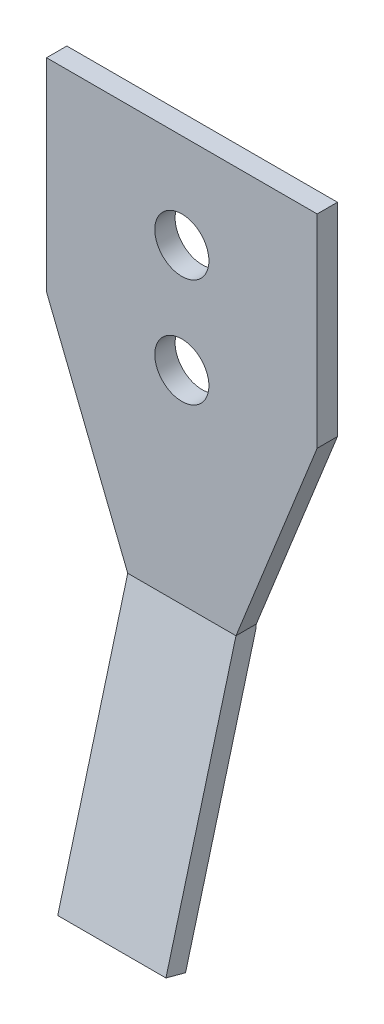
ISO-10303-21;
HEADER;
FILE_DESCRIPTION(('STEP AP214'),'2;1');
FILE_NAME('part.step','',(''),(''),'','','');
FILE_SCHEMA(('AUTOMOTIVE_DESIGN { 1 0 10303 214 1 1 1 1 }'));
ENDSEC;
DATA;
#1=APPLICATION_CONTEXT('core data for automotive mechanical design processes');
#2=APPLICATION_PROTOCOL_DEFINITION('international standard','automotive_design',2000,#1);
#3=PRODUCT_CONTEXT('',#1,'mechanical');
#4=PRODUCT('Part','Part','',(#3));
#5=PRODUCT_RELATED_PRODUCT_CATEGORY('part','',(#4));
#6=PRODUCT_DEFINITION_FORMATION('','',#4);
#7=PRODUCT_DEFINITION_CONTEXT('part definition',#1,'design');
#8=PRODUCT_DEFINITION('design','',#6,#7);
#9=PRODUCT_DEFINITION_SHAPE('','',#8);
#10=(LENGTH_UNIT() NAMED_UNIT(*) SI_UNIT(.MILLI.,.METRE.));
#11=(NAMED_UNIT(*) PLANE_ANGLE_UNIT() SI_UNIT($,.RADIAN.));
#12=(NAMED_UNIT(*) SI_UNIT($,.STERADIAN.) SOLID_ANGLE_UNIT());
#13=UNCERTAINTY_MEASURE_WITH_UNIT(LENGTH_MEASURE(1.E-05),#10,'distance_accuracy_value','');
#14=(GEOMETRIC_REPRESENTATION_CONTEXT(3) GLOBAL_UNCERTAINTY_ASSIGNED_CONTEXT((#13)) GLOBAL_UNIT_ASSIGNED_CONTEXT((#10,
#11,#12)) REPRESENTATION_CONTEXT('',''));
#15=CARTESIAN_POINT('',(0.,0.,0.));
#16=DIRECTION('',(0.,0.,1.));
#17=DIRECTION('',(1.,0.,0.));
#18=AXIS2_PLACEMENT_3D('',#15,#16,#17);
#19=CARTESIAN_POINT('',(0.,0.,15.));
#20=DIRECTION('',(0.,0.,1.));
#21=DIRECTION('',(1.,0.,0.));
#22=AXIS2_PLACEMENT_3D('',#19,#20,#21);
#23=PLANE('',#22);
#24=DIRECTION('',(0.371390676354104,0.928476690885259,0.));
#25=VECTOR('',#24,1.);
#26=CARTESIAN_POINT('',(-60.,0.,15.));
#27=LINE('',#26,#25);
#28=CARTESIAN_POINT('',(-60.,0.,15.));
#29=VERTEX_POINT('',#28);
#30=CARTESIAN_POINT('',(0.,150.,15.));
#31=VERTEX_POINT('',#30);
#32=EDGE_CURVE('E48',#29,#31,#27,.T.);
#33=ORIENTED_EDGE('',*,*,#32,.T.);
#34=DIRECTION('',(0.,1.,0.));
#35=VECTOR('',#34,1.);
#36=CARTESIAN_POINT('',(0.,0.,15.));
#37=LINE('',#36,#35);
#38=CARTESIAN_POINT('',(0.,300.,15.));
#39=VERTEX_POINT('',#38);
#40=EDGE_CURVE('E96',#31,#39,#37,.T.);
#41=ORIENTED_EDGE('',*,*,#40,.T.);
#42=DIRECTION('',(-1.,0.,0.));
#43=VECTOR('',#42,1.);
#44=CARTESIAN_POINT('',(0.,300.,15.));
#45=LINE('',#44,#43);
#46=CARTESIAN_POINT('',(-200.,300.,15.));
#47=VERTEX_POINT('',#46);
#48=EDGE_CURVE('E57',#39,#47,#45,.T.);
#49=ORIENTED_EDGE('',*,*,#48,.T.);
#50=DIRECTION('',(0.,-1.,0.));
#51=VECTOR('',#50,1.);
#52=CARTESIAN_POINT('',(-200.,0.,15.));
#53=LINE('',#52,#51);
#54=CARTESIAN_POINT('',(-200.,150.,15.));
#55=VERTEX_POINT('',#54);
#56=EDGE_CURVE('E85',#47,#55,#53,.T.);
#57=ORIENTED_EDGE('',*,*,#56,.T.);
#58=DIRECTION('',(0.371390676354104,-0.928476690885259,0.));
#59=VECTOR('',#58,1.);
#60=CARTESIAN_POINT('',(-140.,0.,15.));
#61=LINE('',#60,#59);
#62=CARTESIAN_POINT('',(-140.,0.,15.));
#63=VERTEX_POINT('',#62);
#64=EDGE_CURVE('E121',#55,#63,#61,.T.);
#65=ORIENTED_EDGE('',*,*,#64,.T.);
#66=DIRECTION('',(1.,0.,0.));
#67=VECTOR('',#66,1.);
#68=CARTESIAN_POINT('',(0.,0.,15.));
#69=LINE('',#68,#67);
#70=EDGE_CURVE('E86',#63,#29,#69,.T.);
#71=ORIENTED_EDGE('',*,*,#70,.T.);
#72=EDGE_LOOP('',(#33,#41,#49,#57,#65,#71));
#73=FACE_BOUND('',#72,.T.);
#74=CARTESIAN_POINT('',(-100.,230.,15.));
#75=DIRECTION('',(0.,0.,1.));
#76=DIRECTION('',(1.,0.,0.));
#77=AXIS2_PLACEMENT_3D('',#74,#75,#76);
#78=CIRCLE('',#77,20.);
#79=CARTESIAN_POINT('',(-80.,230.,15.));
#80=VERTEX_POINT('',#79);
#81=EDGE_CURVE('E100',#80,#80,#78,.T.);
#82=ORIENTED_EDGE('',*,*,#81,.F.);
#83=EDGE_LOOP('',(#82));
#84=FACE_BOUND('',#83,.T.);
#85=CARTESIAN_POINT('',(-99.9999999999999,150.,15.));
#86=DIRECTION('',(0.,0.,1.));
#87=DIRECTION('',(1.,0.,0.));
#88=AXIS2_PLACEMENT_3D('',#85,#86,#87);
#89=CIRCLE('',#88,20.);
#90=CARTESIAN_POINT('',(-79.9999999999998,150.,15.));
#91=VERTEX_POINT('',#90);
#92=EDGE_CURVE('E108',#91,#91,#89,.T.);
#93=ORIENTED_EDGE('',*,*,#92,.F.);
#94=EDGE_LOOP('',(#93));
#95=FACE_BOUND('',#94,.T.);
#96=ADVANCED_FACE('F33',(#73,#84,#95),#23,.T.);
#97=CARTESIAN_POINT('',(0.,0.,0.));
#98=DIRECTION('',(0.,0.,1.));
#99=DIRECTION('',(1.,0.,0.));
#100=AXIS2_PLACEMENT_3D('',#97,#98,#99);
#101=PLANE('',#100);
#102=DIRECTION('',(0.,1.,0.));
#103=VECTOR('',#102,1.);
#104=CARTESIAN_POINT('',(0.,0.,0.));
#105=LINE('',#104,#103);
#106=CARTESIAN_POINT('',(0.,150.,0.));
#107=VERTEX_POINT('',#106);
#108=CARTESIAN_POINT('',(0.,300.,0.));
#109=VERTEX_POINT('',#108);
#110=EDGE_CURVE('E78',#107,#109,#105,.T.);
#111=ORIENTED_EDGE('',*,*,#110,.F.);
#112=DIRECTION('',(0.371390676354104,0.928476690885259,0.));
#113=VECTOR('',#112,1.);
#114=CARTESIAN_POINT('',(-60.,0.,0.));
#115=LINE('',#114,#113);
#116=CARTESIAN_POINT('',(-60.,0.,0.));
#117=VERTEX_POINT('',#116);
#118=EDGE_CURVE('E124',#117,#107,#115,.T.);
#119=ORIENTED_EDGE('',*,*,#118,.F.);
#120=DIRECTION('',(1.,0.,0.));
#121=VECTOR('',#120,1.);
#122=CARTESIAN_POINT('',(0.,0.,0.));
#123=LINE('',#122,#121);
#124=CARTESIAN_POINT('',(-140.,0.,0.));
#125=VERTEX_POINT('',#124);
#126=EDGE_CURVE('E93',#125,#117,#123,.T.);
#127=ORIENTED_EDGE('',*,*,#126,.F.);
#128=DIRECTION('',(0.371390676354104,-0.928476690885259,0.));
#129=VECTOR('',#128,1.);
#130=CARTESIAN_POINT('',(-140.,0.,0.));
#131=LINE('',#130,#129);
#132=CARTESIAN_POINT('',(-200.,150.,0.));
#133=VERTEX_POINT('',#132);
#134=EDGE_CURVE('E92',#133,#125,#131,.T.);
#135=ORIENTED_EDGE('',*,*,#134,.F.);
#136=DIRECTION('',(0.,-1.,0.));
#137=VECTOR('',#136,1.);
#138=CARTESIAN_POINT('',(-200.,0.,0.));
#139=LINE('',#138,#137);
#140=CARTESIAN_POINT('',(-200.,300.,0.));
#141=VERTEX_POINT('',#140);
#142=EDGE_CURVE('E77',#141,#133,#139,.T.);
#143=ORIENTED_EDGE('',*,*,#142,.F.);
#144=DIRECTION('',(-1.,0.,0.));
#145=VECTOR('',#144,1.);
#146=CARTESIAN_POINT('',(0.,300.,0.));
#147=LINE('',#146,#145);
#148=EDGE_CURVE('E69',#109,#141,#147,.T.);
#149=ORIENTED_EDGE('',*,*,#148,.F.);
#150=EDGE_LOOP('',(#111,#119,#127,#135,#143,#149));
#151=FACE_BOUND('',#150,.T.);
#152=CARTESIAN_POINT('',(-100.,230.,0.));
#153=DIRECTION('',(0.,0.,1.));
#154=DIRECTION('',(1.,0.,0.));
#155=AXIS2_PLACEMENT_3D('',#152,#153,#154);
#156=CIRCLE('',#155,20.);
#157=CARTESIAN_POINT('',(-80.,230.,0.));
#158=VERTEX_POINT('',#157);
#159=EDGE_CURVE('E105',#158,#158,#156,.T.);
#160=ORIENTED_EDGE('',*,*,#159,.T.);
#161=EDGE_LOOP('',(#160));
#162=FACE_BOUND('',#161,.T.);
#163=CARTESIAN_POINT('',(-99.9999999999999,150.,0.));
#164=DIRECTION('',(0.,0.,1.));
#165=DIRECTION('',(1.,0.,0.));
#166=AXIS2_PLACEMENT_3D('',#163,#164,#165);
#167=CIRCLE('',#166,20.);
#168=CARTESIAN_POINT('',(-79.9999999999998,150.,0.));
#169=VERTEX_POINT('',#168);
#170=EDGE_CURVE('E111',#169,#169,#167,.T.);
#171=ORIENTED_EDGE('',*,*,#170,.T.);
#172=EDGE_LOOP('',(#171));
#173=FACE_BOUND('',#172,.T.);
#174=ADVANCED_FACE('F88',(#151,#162,#173),#101,.F.);
#175=CARTESIAN_POINT('',(0.,0.,15.));
#176=DIRECTION('',(-1.,0.,0.));
#177=DIRECTION('',(0.,-1.,0.));
#178=AXIS2_PLACEMENT_3D('',#175,#176,#177);
#179=PLANE('',#178);
#180=ORIENTED_EDGE('',*,*,#40,.F.);
#181=DIRECTION('',(0.,0.,-1.));
#182=VECTOR('',#181,1.);
#183=CARTESIAN_POINT('',(0.,150.,15.));
#184=LINE('',#183,#182);
#185=EDGE_CURVE('E114',#31,#107,#184,.T.);
#186=ORIENTED_EDGE('',*,*,#185,.T.);
#187=ORIENTED_EDGE('',*,*,#110,.T.);
#188=DIRECTION('',(0.,0.,-1.));
#189=VECTOR('',#188,1.);
#190=CARTESIAN_POINT('',(0.,300.,15.));
#191=LINE('',#190,#189);
#192=EDGE_CURVE('E11',#39,#109,#191,.T.);
#193=ORIENTED_EDGE('',*,*,#192,.F.);
#194=EDGE_LOOP('',(#180,#186,#187,#193));
#195=FACE_BOUND('',#194,.T.);
#196=ADVANCED_FACE('F35',(#195),#179,.F.);
#197=CARTESIAN_POINT('',(0.,300.,15.));
#198=DIRECTION('',(0.,-1.,0.));
#199=DIRECTION('',(0.,0.,-1.));
#200=AXIS2_PLACEMENT_3D('',#197,#198,#199);
#201=PLANE('',#200);
#202=ORIENTED_EDGE('',*,*,#148,.T.);
#203=DIRECTION('',(0.,0.,-1.));
#204=VECTOR('',#203,1.);
#205=CARTESIAN_POINT('',(-200.,300.,15.));
#206=LINE('',#205,#204);
#207=EDGE_CURVE('E41',#47,#141,#206,.T.);
#208=ORIENTED_EDGE('',*,*,#207,.F.);
#209=ORIENTED_EDGE('',*,*,#48,.F.);
#210=ORIENTED_EDGE('',*,*,#192,.T.);
#211=EDGE_LOOP('',(#202,#208,#209,#210));
#212=FACE_BOUND('',#211,.T.);
#213=ADVANCED_FACE('F71',(#212),#201,.F.);
#214=CARTESIAN_POINT('',(-200.,0.,15.));
#215=DIRECTION('',(1.,0.,0.));
#216=DIRECTION('',(0.,0.,-1.));
#217=AXIS2_PLACEMENT_3D('',#214,#215,#216);
#218=PLANE('',#217);
#219=ORIENTED_EDGE('',*,*,#142,.T.);
#220=DIRECTION('',(0.,0.,-1.));
#221=VECTOR('',#220,1.);
#222=CARTESIAN_POINT('',(-200.,150.,15.));
#223=LINE('',#222,#221);
#224=EDGE_CURVE('E117',#55,#133,#223,.T.);
#225=ORIENTED_EDGE('',*,*,#224,.F.);
#226=ORIENTED_EDGE('',*,*,#56,.F.);
#227=ORIENTED_EDGE('',*,*,#207,.T.);
#228=EDGE_LOOP('',(#219,#225,#226,#227));
#229=FACE_BOUND('',#228,.T.);
#230=ADVANCED_FACE('F82',(#229),#218,.F.);
#231=CARTESIAN_POINT('',(-100.,230.,15.));
#232=DIRECTION('',(0.,0.,-1.));
#233=DIRECTION('',(-1.,0.,0.));
#234=AXIS2_PLACEMENT_3D('',#231,#232,#233);
#235=CYLINDRICAL_SURFACE('',#234,20.);
#236=ORIENTED_EDGE('',*,*,#81,.T.);
#237=EDGE_LOOP('',(#236));
#238=FACE_BOUND('',#237,.T.);
#239=ORIENTED_EDGE('',*,*,#159,.F.);
#240=EDGE_LOOP('',(#239));
#241=FACE_BOUND('',#240,.T.);
#242=ADVANCED_FACE('F238',(#238,#241),#235,.F.);
#243=CARTESIAN_POINT('',(-99.9999999999999,150.,15.));
#244=DIRECTION('',(0.,0.,-1.));
#245=DIRECTION('',(-1.,0.,0.));
#246=AXIS2_PLACEMENT_3D('',#243,#244,#245);
#247=CYLINDRICAL_SURFACE('',#246,20.);
#248=ORIENTED_EDGE('',*,*,#92,.T.);
#249=EDGE_LOOP('',(#248));
#250=FACE_BOUND('',#249,.T.);
#251=ORIENTED_EDGE('',*,*,#170,.F.);
#252=EDGE_LOOP('',(#251));
#253=FACE_BOUND('',#252,.T.);
#254=ADVANCED_FACE('F244',(#250,#253),#247,.F.);
#255=CARTESIAN_POINT('',(-140.,0.,15.));
#256=DIRECTION('',(0.928476690885259,0.371390676354104,0.));
#257=DIRECTION('',(-0.371390676354104,0.928476690885259,0.));
#258=AXIS2_PLACEMENT_3D('',#255,#256,#257);
#259=PLANE('',#258);
#260=ORIENTED_EDGE('',*,*,#134,.T.);
#261=DIRECTION('',(0.,0.,-1.));
#262=VECTOR('',#261,1.);
#263=CARTESIAN_POINT('',(-140.,0.,15.));
#264=LINE('',#263,#262);
#265=EDGE_CURVE('E120',#63,#125,#264,.T.);
#266=ORIENTED_EDGE('',*,*,#265,.F.);
#267=ORIENTED_EDGE('',*,*,#64,.F.);
#268=ORIENTED_EDGE('',*,*,#224,.T.);
#269=EDGE_LOOP('',(#260,#266,#267,#268));
#270=FACE_BOUND('',#269,.T.);
#271=ADVANCED_FACE('F203',(#270),#259,.F.);
#272=CARTESIAN_POINT('',(-60.,0.,15.));
#273=DIRECTION('',(-0.928476690885259,0.371390676354104,0.));
#274=DIRECTION('',(-0.371390676354104,-0.928476690885259,0.));
#275=AXIS2_PLACEMENT_3D('',#272,#273,#274);
#276=PLANE('',#275);
#277=ORIENTED_EDGE('',*,*,#118,.T.);
#278=ORIENTED_EDGE('',*,*,#185,.F.);
#279=ORIENTED_EDGE('',*,*,#32,.F.);
#280=DIRECTION('',(0.,0.,-1.));
#281=VECTOR('',#280,1.);
#282=CARTESIAN_POINT('',(-60.,0.,15.));
#283=LINE('',#282,#281);
#284=EDGE_CURVE('E129',#29,#117,#283,.T.);
#285=ORIENTED_EDGE('',*,*,#284,.T.);
#286=EDGE_LOOP('',(#277,#278,#279,#285));
#287=FACE_BOUND('',#286,.T.);
#288=ADVANCED_FACE('F221',(#287),#276,.F.);
#289=CARTESIAN_POINT('',(-60.,-3.88228567653783,0.511112605663979));
#290=DIRECTION('',(-1.,0.,0.));
#291=DIRECTION('',(0.,-1.,0.));
#292=AXIS2_PLACEMENT_3D('',#289,#290,#291);
#293=PLANE('',#292);
#294=ORIENTED_EDGE('',*,*,#284,.F.);
#295=DIRECTION('',(0.,0.965925826289068,-0.258819045102521));
#296=VECTOR('',#295,1.);
#297=CARTESIAN_POINT('',(-60.,-193.185165257814,66.7638090205043));
#298=LINE('',#297,#296);
#299=CARTESIAN_POINT('',(-60.,-193.185165257814,66.7638090205043));
#300=VERTEX_POINT('',#299);
#301=EDGE_CURVE('E150',#300,#29,#298,.T.);
#302=ORIENTED_EDGE('',*,*,#301,.F.);
#303=DIRECTION('',(0.,0.258819045102521,0.965925826289068));
#304=VECTOR('',#303,1.);
#305=CARTESIAN_POINT('',(-60.,-197.067450934351,52.2749216261683));
#306=LINE('',#305,#304);
#307=CARTESIAN_POINT('',(-60.,-197.067450934351,52.2749216261683));
#308=VERTEX_POINT('',#307);
#309=EDGE_CURVE('E159',#308,#300,#306,.T.);
#310=ORIENTED_EDGE('',*,*,#309,.F.);
#311=DIRECTION('',(0.,0.965925826289068,-0.258819045102521));
#312=VECTOR('',#311,1.);
#313=CARTESIAN_POINT('',(-60.,-197.067450934351,52.2749216261683));
#314=LINE('',#313,#312);
#315=CARTESIAN_POINT('',(-60.,-3.88228567653783,0.511112605663976));
#316=VERTEX_POINT('',#315);
#317=EDGE_CURVE('E147',#308,#316,#314,.T.);
#318=ORIENTED_EDGE('',*,*,#317,.T.);
#319=CARTESIAN_POINT('',(-60.,0.,15.));
#320=DIRECTION('',(1.,0.,0.));
#321=DIRECTION('',(0.,1.,0.));
#322=AXIS2_PLACEMENT_3D('',#319,#320,#321);
#323=CIRCLE('',#322,15.);
#324=EDGE_CURVE('E138',#316,#117,#323,.T.);
#325=ORIENTED_EDGE('',*,*,#324,.T.);
#326=EDGE_LOOP('',(#294,#302,#310,#318,#325));
#327=FACE_BOUND('',#326,.T.);
#328=ADVANCED_FACE('F213',(#327),#293,.F.);
#329=CARTESIAN_POINT('',(-140.,-3.88228567653785,0.511112605663979));
#330=DIRECTION('',(1.,0.,0.));
#331=DIRECTION('',(0.,1.,0.));
#332=AXIS2_PLACEMENT_3D('',#329,#330,#331);
#333=PLANE('',#332);
#334=CARTESIAN_POINT('',(-140.,0.,15.));
#335=DIRECTION('',(1.,0.,0.));
#336=DIRECTION('',(0.,1.,0.));
#337=AXIS2_PLACEMENT_3D('',#334,#335,#336);
#338=CIRCLE('',#337,15.);
#339=CARTESIAN_POINT('',(-140.,-3.88228567653785,0.511112605663979));
#340=VERTEX_POINT('',#339);
#341=EDGE_CURVE('E126',#340,#125,#338,.T.);
#342=ORIENTED_EDGE('',*,*,#341,.F.);
#343=DIRECTION('',(0.,0.965925826289068,-0.258819045102521));
#344=VECTOR('',#343,1.);
#345=CARTESIAN_POINT('',(-140.,-197.067450934351,52.2749216261683));
#346=LINE('',#345,#344);
#347=CARTESIAN_POINT('',(-140.,-197.067450934351,52.2749216261683));
#348=VERTEX_POINT('',#347);
#349=EDGE_CURVE('E144',#348,#340,#346,.T.);
#350=ORIENTED_EDGE('',*,*,#349,.F.);
#351=DIRECTION('',(0.,-0.258819045102521,-0.965925826289068));
#352=VECTOR('',#351,1.);
#353=CARTESIAN_POINT('',(-140.,-197.067450934351,52.2749216261683));
#354=LINE('',#353,#352);
#355=CARTESIAN_POINT('',(-140.,-193.185165257814,66.7638090205043));
#356=VERTEX_POINT('',#355);
#357=EDGE_CURVE('E165',#356,#348,#354,.T.);
#358=ORIENTED_EDGE('',*,*,#357,.F.);
#359=DIRECTION('',(0.,0.965925826289068,-0.258819045102521));
#360=VECTOR('',#359,1.);
#361=CARTESIAN_POINT('',(-140.,-193.185165257814,66.7638090205043));
#362=LINE('',#361,#360);
#363=EDGE_CURVE('E153',#356,#63,#362,.T.);
#364=ORIENTED_EDGE('',*,*,#363,.T.);
#365=ORIENTED_EDGE('',*,*,#265,.T.);
#366=EDGE_LOOP('',(#342,#350,#358,#364,#365));
#367=FACE_BOUND('',#366,.T.);
#368=ADVANCED_FACE('F182',(#367),#333,.F.);
#369=CARTESIAN_POINT('',(-60.,0.,15.));
#370=DIRECTION('',(1.,0.,0.));
#371=DIRECTION('',(0.,1.,0.));
#372=AXIS2_PLACEMENT_3D('',#369,#370,#371);
#373=CYLINDRICAL_SURFACE('',#372,15.);
#374=DIRECTION('',(1.,0.,0.));
#375=VECTOR('',#374,1.);
#376=CARTESIAN_POINT('',(-60.,-3.88228567653783,0.511112605663979));
#377=LINE('',#376,#375);
#378=EDGE_CURVE('E141',#340,#316,#377,.T.);
#379=ORIENTED_EDGE('',*,*,#378,.F.);
#380=ORIENTED_EDGE('',*,*,#341,.T.);
#381=ORIENTED_EDGE('',*,*,#126,.T.);
#382=ORIENTED_EDGE('',*,*,#324,.F.);
#383=EDGE_LOOP('',(#379,#380,#381,#382));
#384=FACE_BOUND('',#383,.T.);
#385=ADVANCED_FACE('F219',(#384),#373,.T.);
#386=CARTESIAN_POINT('',(-140.,-197.067450934351,52.2749216261683));
#387=DIRECTION('',(0.,0.258819045102521,0.965925826289068));
#388=DIRECTION('',(0.,-0.965925826289068,0.258819045102521));
#389=AXIS2_PLACEMENT_3D('',#386,#387,#388);
#390=PLANE('',#389);
#391=ORIENTED_EDGE('',*,*,#378,.T.);
#392=ORIENTED_EDGE('',*,*,#317,.F.);
#393=DIRECTION('',(1.,0.,0.));
#394=VECTOR('',#393,1.);
#395=CARTESIAN_POINT('',(-140.,-197.067450934351,52.2749216261683));
#396=LINE('',#395,#394);
#397=EDGE_CURVE('E162',#348,#308,#396,.T.);
#398=ORIENTED_EDGE('',*,*,#397,.F.);
#399=ORIENTED_EDGE('',*,*,#349,.T.);
#400=EDGE_LOOP('',(#391,#392,#398,#399));
#401=FACE_BOUND('',#400,.T.);
#402=ADVANCED_FACE('F186',(#401),#390,.F.);
#403=CARTESIAN_POINT('',(-140.,-193.185165257814,66.7638090205043));
#404=DIRECTION('',(0.,-0.258819045102521,-0.965925826289068));
#405=DIRECTION('',(0.,0.965925826289068,-0.258819045102521));
#406=AXIS2_PLACEMENT_3D('',#403,#404,#405);
#407=PLANE('',#406);
#408=ORIENTED_EDGE('',*,*,#70,.F.);
#409=ORIENTED_EDGE('',*,*,#363,.F.);
#410=DIRECTION('',(-1.,0.,0.));
#411=VECTOR('',#410,1.);
#412=CARTESIAN_POINT('',(-140.,-193.185165257814,66.7638090205043));
#413=LINE('',#412,#411);
#414=EDGE_CURVE('E156',#300,#356,#413,.T.);
#415=ORIENTED_EDGE('',*,*,#414,.F.);
#416=ORIENTED_EDGE('',*,*,#301,.T.);
#417=EDGE_LOOP('',(#408,#409,#415,#416));
#418=FACE_BOUND('',#417,.T.);
#419=ADVANCED_FACE('F208',(#418),#407,.F.);
#420=CARTESIAN_POINT('',(0.,-196.935165257814,52.768618492121));
#421=DIRECTION('',(0.,0.965925826289068,-0.258819045102521));
#422=DIRECTION('',(0.,0.258819045102521,0.965925826289068));
#423=AXIS2_PLACEMENT_3D('',#420,#421,#422);
#424=PLANE('',#423);
#425=ORIENTED_EDGE('',*,*,#357,.T.);
#426=ORIENTED_EDGE('',*,*,#397,.T.);
#427=ORIENTED_EDGE('',*,*,#309,.T.);
#428=ORIENTED_EDGE('',*,*,#414,.T.);
#429=EDGE_LOOP('',(#425,#426,#427,#428));
#430=FACE_BOUND('',#429,.T.);
#431=ADVANCED_FACE('F171',(#430),#424,.F.);
#432=CLOSED_SHELL('',(#96,#174,#196,#213,#230,#242,#254,#271,#288,#328,#368,#385,#402,#419,#431));
#433=MANIFOLD_SOLID_BREP('B2',#432);
#434=ADVANCED_BREP_SHAPE_REPRESENTATION('',(#18,#433),#14);
#435=SHAPE_DEFINITION_REPRESENTATION(#9,#434);
ENDSEC;
END-ISO-10303-21;
